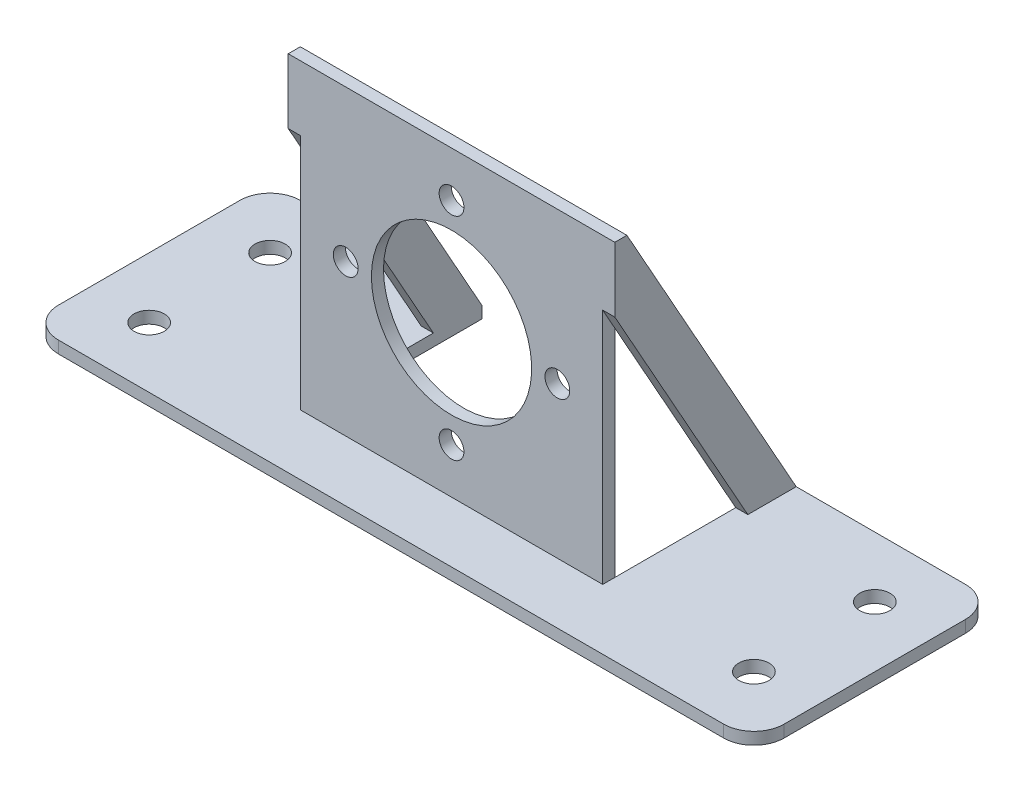
ISO-10303-21;
HEADER;
FILE_DESCRIPTION(('STEP AP214'),'2;1');
FILE_NAME('part.step','',(''),(''),'','','');
FILE_SCHEMA(('AUTOMOTIVE_DESIGN { 1 0 10303 214 1 1 1 1 }'));
ENDSEC;
DATA;
#1=APPLICATION_CONTEXT('core data for automotive mechanical design processes');
#2=APPLICATION_PROTOCOL_DEFINITION('international standard','automotive_design',2000,#1);
#3=PRODUCT_CONTEXT('',#1,'mechanical');
#4=PRODUCT('Part','Part','',(#3));
#5=PRODUCT_RELATED_PRODUCT_CATEGORY('part','',(#4));
#6=PRODUCT_DEFINITION_FORMATION('','',#4);
#7=PRODUCT_DEFINITION_CONTEXT('part definition',#1,'design');
#8=PRODUCT_DEFINITION('design','',#6,#7);
#9=PRODUCT_DEFINITION_SHAPE('','',#8);
#10=(LENGTH_UNIT() NAMED_UNIT(*) SI_UNIT(.MILLI.,.METRE.));
#11=(NAMED_UNIT(*) PLANE_ANGLE_UNIT() SI_UNIT($,.RADIAN.));
#12=(NAMED_UNIT(*) SI_UNIT($,.STERADIAN.) SOLID_ANGLE_UNIT());
#13=UNCERTAINTY_MEASURE_WITH_UNIT(LENGTH_MEASURE(1.E-05),#10,'distance_accuracy_value','');
#14=(GEOMETRIC_REPRESENTATION_CONTEXT(3) GLOBAL_UNCERTAINTY_ASSIGNED_CONTEXT((#13)) GLOBAL_UNIT_ASSIGNED_CONTEXT((#10,
#11,#12)) REPRESENTATION_CONTEXT('',''));
#15=CARTESIAN_POINT('',(0.,0.,0.));
#16=DIRECTION('',(0.,0.,1.));
#17=DIRECTION('',(1.,0.,0.));
#18=AXIS2_PLACEMENT_3D('',#15,#16,#17);
#19=CARTESIAN_POINT('',(0.,2.,0.));
#20=DIRECTION('',(0.,-1.,0.));
#21=DIRECTION('',(0.,0.,-1.));
#22=AXIS2_PLACEMENT_3D('',#19,#20,#21);
#23=PLANE('',#22);
#24=CARTESIAN_POINT('',(10.,2.,-30.));
#25=DIRECTION('',(0.,1.,0.));
#26=DIRECTION('',(0.,0.,1.));
#27=AXIS2_PLACEMENT_3D('',#24,#25,#26);
#28=CIRCLE('',#27,2.5);
#29=CARTESIAN_POINT('',(10.,2.,-27.5));
#30=VERTEX_POINT('',#29);
#31=EDGE_CURVE('E389',#30,#30,#28,.T.);
#32=ORIENTED_EDGE('',*,*,#31,.F.);
#33=EDGE_LOOP('',(#32));
#34=FACE_BOUND('',#33,.T.);
#35=CARTESIAN_POINT('',(10.,2.,-10.));
#36=DIRECTION('',(0.,1.,0.));
#37=DIRECTION('',(0.,0.,1.));
#38=AXIS2_PLACEMENT_3D('',#35,#36,#37);
#39=CIRCLE('',#38,2.5);
#40=CARTESIAN_POINT('',(10.,2.,-7.5));
#41=VERTEX_POINT('',#40);
#42=EDGE_CURVE('E381',#41,#41,#39,.T.);
#43=ORIENTED_EDGE('',*,*,#42,.F.);
#44=EDGE_LOOP('',(#43));
#45=FACE_BOUND('',#44,.T.);
#46=CARTESIAN_POINT('',(110.,2.,-10.));
#47=DIRECTION('',(0.,1.,0.));
#48=DIRECTION('',(0.,0.,-1.));
#49=AXIS2_PLACEMENT_3D('',#46,#47,#48);
#50=CIRCLE('',#49,2.49999999999998);
#51=CARTESIAN_POINT('',(110.,2.,-12.5));
#52=VERTEX_POINT('',#51);
#53=EDGE_CURVE('E373',#52,#52,#50,.T.);
#54=ORIENTED_EDGE('',*,*,#53,.F.);
#55=EDGE_LOOP('',(#54));
#56=FACE_BOUND('',#55,.T.);
#57=CARTESIAN_POINT('',(110.,2.,-30.));
#58=DIRECTION('',(0.,1.,0.));
#59=DIRECTION('',(0.,0.,-1.));
#60=AXIS2_PLACEMENT_3D('',#57,#58,#59);
#61=CIRCLE('',#60,2.49999999999998);
#62=CARTESIAN_POINT('',(110.,2.,-32.5));
#63=VERTEX_POINT('',#62);
#64=EDGE_CURVE('E365',#63,#63,#61,.T.);
#65=ORIENTED_EDGE('',*,*,#64,.F.);
#66=EDGE_LOOP('',(#65));
#67=FACE_BOUND('',#66,.T.);
#68=DIRECTION('',(0.,0.,1.));
#69=VECTOR('',#68,1.);
#70=CARTESIAN_POINT('',(0.,2.,0.));
#71=LINE('',#70,#69);
#72=CARTESIAN_POINT('',(0.,2.,-35.));
#73=VERTEX_POINT('',#72);
#74=CARTESIAN_POINT('',(0.,2.,-5.));
#75=VERTEX_POINT('',#74);
#76=EDGE_CURVE('E397',#73,#75,#71,.T.);
#77=ORIENTED_EDGE('',*,*,#76,.T.);
#78=CARTESIAN_POINT('',(5.,2.,-5.));
#79=DIRECTION('',(0.,-1.,0.));
#80=DIRECTION('',(0.,0.,-1.));
#81=AXIS2_PLACEMENT_3D('',#78,#79,#80);
#82=CIRCLE('',#81,5.);
#83=CARTESIAN_POINT('',(5.,2.,0.));
#84=VERTEX_POINT('',#83);
#85=EDGE_CURVE('E492',#75,#84,#82,.F.);
#86=ORIENTED_EDGE('',*,*,#85,.T.);
#87=DIRECTION('',(1.,0.,0.));
#88=VECTOR('',#87,1.);
#89=CARTESIAN_POINT('',(0.,2.,0.));
#90=LINE('',#89,#88);
#91=CARTESIAN_POINT('',(115.,2.,0.));
#92=VERTEX_POINT('',#91);
#93=EDGE_CURVE('E401',#84,#92,#90,.T.);
#94=ORIENTED_EDGE('',*,*,#93,.T.);
#95=CARTESIAN_POINT('',(115.,2.,-5.));
#96=DIRECTION('',(0.,-1.,0.));
#97=DIRECTION('',(0.,0.,-1.));
#98=AXIS2_PLACEMENT_3D('',#95,#96,#97);
#99=CIRCLE('',#98,5.);
#100=CARTESIAN_POINT('',(120.,2.,-5.));
#101=VERTEX_POINT('',#100);
#102=EDGE_CURVE('E486',#92,#101,#99,.F.);
#103=ORIENTED_EDGE('',*,*,#102,.T.);
#104=DIRECTION('',(0.,0.,-1.));
#105=VECTOR('',#104,1.);
#106=CARTESIAN_POINT('',(120.,2.,0.));
#107=LINE('',#106,#105);
#108=CARTESIAN_POINT('',(120.,2.,-35.));
#109=VERTEX_POINT('',#108);
#110=EDGE_CURVE('E406',#101,#109,#107,.T.);
#111=ORIENTED_EDGE('',*,*,#110,.T.);
#112=CARTESIAN_POINT('',(115.,2.,-35.));
#113=DIRECTION('',(0.,-1.,0.));
#114=DIRECTION('',(0.,0.,-1.));
#115=AXIS2_PLACEMENT_3D('',#112,#113,#114);
#116=CIRCLE('',#115,5.);
#117=CARTESIAN_POINT('',(115.,2.,-40.));
#118=VERTEX_POINT('',#117);
#119=EDGE_CURVE('E55',#109,#118,#116,.F.);
#120=ORIENTED_EDGE('',*,*,#119,.T.);
#121=DIRECTION('',(-1.,0.,0.));
#122=VECTOR('',#121,1.);
#123=CARTESIAN_POINT('',(85.,2.,-40.));
#124=LINE('',#123,#122);
#125=CARTESIAN_POINT('',(87.,2.,-40.));
#126=VERTEX_POINT('',#125);
#127=EDGE_CURVE('E409',#118,#126,#124,.T.);
#128=ORIENTED_EDGE('',*,*,#127,.T.);
#129=DIRECTION('',(0.,0.,-1.));
#130=VECTOR('',#129,1.);
#131=CARTESIAN_POINT('',(87.,2.,-32.));
#132=LINE('',#131,#130);
#133=CARTESIAN_POINT('',(87.,2.,-32.));
#134=VERTEX_POINT('',#133);
#135=EDGE_CURVE('E235',#134,#126,#132,.T.);
#136=ORIENTED_EDGE('',*,*,#135,.F.);
#137=DIRECTION('',(-1.,0.,0.));
#138=VECTOR('',#137,1.);
#139=CARTESIAN_POINT('',(87.,2.,-32.));
#140=LINE('',#139,#138);
#141=CARTESIAN_POINT('',(85.,2.,-32.));
#142=VERTEX_POINT('',#141);
#143=EDGE_CURVE('E251',#134,#142,#140,.T.);
#144=ORIENTED_EDGE('',*,*,#143,.T.);
#145=DIRECTION('',(0.,0.,1.));
#146=VECTOR('',#145,1.);
#147=CARTESIAN_POINT('',(85.,2.,-10.));
#148=LINE('',#147,#146);
#149=CARTESIAN_POINT('',(85.,2.,-12.));
#150=VERTEX_POINT('',#149);
#151=EDGE_CURVE('E412',#142,#150,#148,.T.);
#152=ORIENTED_EDGE('',*,*,#151,.T.);
#153=DIRECTION('',(0.,0.,-1.));
#154=VECTOR('',#153,1.);
#155=CARTESIAN_POINT('',(85.,2.,0.));
#156=LINE('',#155,#154);
#157=CARTESIAN_POINT('',(85.,2.,-10.));
#158=VERTEX_POINT('',#157);
#159=EDGE_CURVE('E355',#158,#150,#156,.T.);
#160=ORIENTED_EDGE('',*,*,#159,.F.);
#161=DIRECTION('',(-1.,0.,0.));
#162=VECTOR('',#161,1.);
#163=CARTESIAN_POINT('',(35.,2.,-10.));
#164=LINE('',#163,#162);
#165=CARTESIAN_POINT('',(35.,2.,-10.));
#166=VERTEX_POINT('',#165);
#167=EDGE_CURVE('E415',#158,#166,#164,.T.);
#168=ORIENTED_EDGE('',*,*,#167,.T.);
#169=DIRECTION('',(0.,0.,-1.));
#170=VECTOR('',#169,1.);
#171=CARTESIAN_POINT('',(35.,2.,-40.));
#172=LINE('',#171,#170);
#173=CARTESIAN_POINT('',(35.,2.,-12.));
#174=VERTEX_POINT('',#173);
#175=EDGE_CURVE('E419',#166,#174,#172,.T.);
#176=ORIENTED_EDGE('',*,*,#175,.T.);
#177=CARTESIAN_POINT('',(35.,2.,-32.));
#178=VERTEX_POINT('',#177);
#179=EDGE_CURVE('E418',#174,#178,#172,.T.);
#180=ORIENTED_EDGE('',*,*,#179,.T.);
#181=DIRECTION('',(1.,0.,0.));
#182=VECTOR('',#181,1.);
#183=CARTESIAN_POINT('',(33.,2.,-32.));
#184=LINE('',#183,#182);
#185=CARTESIAN_POINT('',(33.,2.,-32.));
#186=VERTEX_POINT('',#185);
#187=EDGE_CURVE('E285',#186,#178,#184,.T.);
#188=ORIENTED_EDGE('',*,*,#187,.F.);
#189=DIRECTION('',(0.,0.,1.));
#190=VECTOR('',#189,1.);
#191=CARTESIAN_POINT('',(33.,2.,-40.));
#192=LINE('',#191,#190);
#193=CARTESIAN_POINT('',(33.,2.,-40.));
#194=VERTEX_POINT('',#193);
#195=EDGE_CURVE('E264',#194,#186,#192,.T.);
#196=ORIENTED_EDGE('',*,*,#195,.F.);
#197=DIRECTION('',(-1.,0.,0.));
#198=VECTOR('',#197,1.);
#199=CARTESIAN_POINT('',(0.,2.,-40.));
#200=LINE('',#199,#198);
#201=CARTESIAN_POINT('',(5.,2.,-40.));
#202=VERTEX_POINT('',#201);
#203=EDGE_CURVE('E423',#194,#202,#200,.T.);
#204=ORIENTED_EDGE('',*,*,#203,.T.);
#205=CARTESIAN_POINT('',(5.,2.,-35.));
#206=DIRECTION('',(0.,-1.,0.));
#207=DIRECTION('',(0.,0.,-1.));
#208=AXIS2_PLACEMENT_3D('',#205,#206,#207);
#209=CIRCLE('',#208,5.);
#210=EDGE_CURVE('E489',#202,#73,#209,.F.);
#211=ORIENTED_EDGE('',*,*,#210,.T.);
#212=EDGE_LOOP('',(#77,#86,#94,#103,#111,#120,#128,#136,#144,#152,#160,#168,#176,#180,#188,#196,
#204,#211));
#213=FACE_BOUND('',#212,.T.);
#214=ADVANCED_FACE('F39',(#34,#45,#56,#67,#213),#23,.F.);
#215=CARTESIAN_POINT('',(85.,0.,-12.));
#216=DIRECTION('',(-1.,0.,0.));
#217=DIRECTION('',(0.,0.,1.));
#218=AXIS2_PLACEMENT_3D('',#215,#216,#217);
#219=PLANE('',#218);
#220=DIRECTION('',(0.,-0.87250601594972,-0.488603368931843));
#221=VECTOR('',#220,1.);
#222=CARTESIAN_POINT('',(85.,2.,-32.));
#223=LINE('',#222,#221);
#224=CARTESIAN_POINT('',(85.,41.2857142857143,-10.));
#225=VERTEX_POINT('',#224);
#226=CARTESIAN_POINT('',(85.,37.7142857142857,-12.));
#227=VERTEX_POINT('',#226);
#228=EDGE_CURVE('E230',#225,#227,#223,.T.);
#229=ORIENTED_EDGE('',*,*,#228,.F.);
#230=DIRECTION('',(0.,-1.,0.));
#231=VECTOR('',#230,1.);
#232=CARTESIAN_POINT('',(85.,0.,-10.));
#233=LINE('',#232,#231);
#234=EDGE_CURVE('E334',#225,#158,#233,.T.);
#235=ORIENTED_EDGE('',*,*,#234,.T.);
#236=ORIENTED_EDGE('',*,*,#159,.T.);
#237=DIRECTION('',(0.,-1.,0.));
#238=VECTOR('',#237,1.);
#239=CARTESIAN_POINT('',(85.,0.,-12.));
#240=LINE('',#239,#238);
#241=EDGE_CURVE('E343',#227,#150,#240,.T.);
#242=ORIENTED_EDGE('',*,*,#241,.F.);
#243=EDGE_LOOP('',(#229,#235,#236,#242));
#244=FACE_BOUND('',#243,.T.);
#245=ADVANCED_FACE('F552',(#244),#219,.F.);
#246=CARTESIAN_POINT('',(35.,0.,-12.));
#247=DIRECTION('',(1.,0.,0.));
#248=DIRECTION('',(0.,0.,-1.));
#249=AXIS2_PLACEMENT_3D('',#246,#247,#248);
#250=PLANE('',#249);
#251=DIRECTION('',(0.,0.87250601594972,0.488603368931843));
#252=VECTOR('',#251,1.);
#253=CARTESIAN_POINT('',(35.,2.,-32.));
#254=LINE('',#253,#252);
#255=CARTESIAN_POINT('',(35.,37.7142857142857,-12.));
#256=VERTEX_POINT('',#255);
#257=CARTESIAN_POINT('',(35.,41.2857142857143,-10.));
#258=VERTEX_POINT('',#257);
#259=EDGE_CURVE('E278',#256,#258,#254,.T.);
#260=ORIENTED_EDGE('',*,*,#259,.F.);
#261=DIRECTION('',(0.,1.,0.));
#262=VECTOR('',#261,1.);
#263=CARTESIAN_POINT('',(35.,0.,-12.));
#264=LINE('',#263,#262);
#265=EDGE_CURVE('E347',#174,#256,#264,.T.);
#266=ORIENTED_EDGE('',*,*,#265,.F.);
#267=ORIENTED_EDGE('',*,*,#175,.F.);
#268=DIRECTION('',(0.,1.,0.));
#269=VECTOR('',#268,1.);
#270=CARTESIAN_POINT('',(35.,0.,-10.));
#271=LINE('',#270,#269);
#272=EDGE_CURVE('E205',#166,#258,#271,.T.);
#273=ORIENTED_EDGE('',*,*,#272,.T.);
#274=EDGE_LOOP('',(#260,#266,#267,#273));
#275=FACE_BOUND('',#274,.T.);
#276=ADVANCED_FACE('F551',(#275),#250,.F.);
#277=CARTESIAN_POINT('',(85.,2.,-10.));
#278=DIRECTION('',(1.,0.,0.));
#279=DIRECTION('',(0.,0.,-1.));
#280=AXIS2_PLACEMENT_3D('',#277,#278,#279);
#281=PLANE('',#280);
#282=CARTESIAN_POINT('',(85.,0.,-12.));
#283=VERTEX_POINT('',#282);
#284=EDGE_CURVE('E204',#150,#283,#240,.T.);
#285=ORIENTED_EDGE('',*,*,#284,.F.);
#286=ORIENTED_EDGE('',*,*,#151,.F.);
#287=EDGE_CURVE('E243',#227,#142,#223,.T.);
#288=ORIENTED_EDGE('',*,*,#287,.F.);
#289=CARTESIAN_POINT('',(85.,52.,-12.));
#290=VERTEX_POINT('',#289);
#291=EDGE_CURVE('E338',#290,#227,#240,.T.);
#292=ORIENTED_EDGE('',*,*,#291,.F.);
#293=DIRECTION('',(0.,0.87250601594972,0.488603368931843));
#294=VECTOR('',#293,1.);
#295=CARTESIAN_POINT('',(85.,2.,-40.));
#296=LINE('',#295,#294);
#297=CARTESIAN_POINT('',(85.,2.,-40.));
#298=VERTEX_POINT('',#297);
#299=EDGE_CURVE('E226',#298,#290,#296,.T.);
#300=ORIENTED_EDGE('',*,*,#299,.F.);
#301=DIRECTION('',(0.,-1.,0.));
#302=VECTOR('',#301,1.);
#303=CARTESIAN_POINT('',(85.,2.,-40.));
#304=LINE('',#303,#302);
#305=CARTESIAN_POINT('',(85.,0.,-40.));
#306=VERTEX_POINT('',#305);
#307=EDGE_CURVE('E454',#298,#306,#304,.T.);
#308=ORIENTED_EDGE('',*,*,#307,.T.);
#309=DIRECTION('',(0.,0.,1.));
#310=VECTOR('',#309,1.);
#311=CARTESIAN_POINT('',(85.,0.,-10.));
#312=LINE('',#311,#310);
#313=EDGE_CURVE('E442',#306,#283,#312,.T.);
#314=ORIENTED_EDGE('',*,*,#313,.T.);
#315=EDGE_LOOP('',(#285,#286,#288,#292,#300,#308,#314));
#316=FACE_BOUND('',#315,.T.);
#317=ADVANCED_FACE('F527',(#316),#281,.F.);
#318=CARTESIAN_POINT('',(35.,2.,-40.));
#319=DIRECTION('',(-1.,0.,0.));
#320=DIRECTION('',(0.,0.,1.));
#321=AXIS2_PLACEMENT_3D('',#318,#319,#320);
#322=PLANE('',#321);
#323=CARTESIAN_POINT('',(35.,0.,-12.));
#324=VERTEX_POINT('',#323);
#325=EDGE_CURVE('E348',#324,#174,#264,.T.);
#326=ORIENTED_EDGE('',*,*,#325,.F.);
#327=DIRECTION('',(0.,0.,-1.));
#328=VECTOR('',#327,1.);
#329=CARTESIAN_POINT('',(35.,0.,-40.));
#330=LINE('',#329,#328);
#331=CARTESIAN_POINT('',(35.,0.,-40.));
#332=VERTEX_POINT('',#331);
#333=EDGE_CURVE('E445',#324,#332,#330,.T.);
#334=ORIENTED_EDGE('',*,*,#333,.T.);
#335=DIRECTION('',(0.,-1.,0.));
#336=VECTOR('',#335,1.);
#337=CARTESIAN_POINT('',(35.,2.,-40.));
#338=LINE('',#337,#336);
#339=CARTESIAN_POINT('',(35.,2.,-40.));
#340=VERTEX_POINT('',#339);
#341=EDGE_CURVE('E428',#340,#332,#338,.T.);
#342=ORIENTED_EDGE('',*,*,#341,.F.);
#343=DIRECTION('',(0.,-0.87250601594972,-0.488603368931843));
#344=VECTOR('',#343,1.);
#345=CARTESIAN_POINT('',(35.,52.,-12.));
#346=LINE('',#345,#344);
#347=CARTESIAN_POINT('',(35.,52.,-12.));
#348=VERTEX_POINT('',#347);
#349=EDGE_CURVE('E256',#348,#340,#346,.T.);
#350=ORIENTED_EDGE('',*,*,#349,.F.);
#351=DIRECTION('',(0.,1.,0.));
#352=VECTOR('',#351,1.);
#353=CARTESIAN_POINT('',(35.,0.,-12.));
#354=LINE('',#353,#352);
#355=EDGE_CURVE('E293',#256,#348,#354,.T.);
#356=ORIENTED_EDGE('',*,*,#355,.F.);
#357=EDGE_CURVE('E260',#178,#256,#254,.T.);
#358=ORIENTED_EDGE('',*,*,#357,.F.);
#359=ORIENTED_EDGE('',*,*,#179,.F.);
#360=EDGE_LOOP('',(#326,#334,#342,#350,#356,#358,#359));
#361=FACE_BOUND('',#360,.T.);
#362=ADVANCED_FACE('F585',(#361),#322,.F.);
#363=CARTESIAN_POINT('',(0.,0.,0.));
#364=DIRECTION('',(0.,-1.,0.));
#365=DIRECTION('',(0.,0.,-1.));
#366=AXIS2_PLACEMENT_3D('',#363,#364,#365);
#367=PLANE('',#366);
#368=CARTESIAN_POINT('',(110.,0.,-10.));
#369=DIRECTION('',(0.,1.,0.));
#370=DIRECTION('',(0.,0.,-1.));
#371=AXIS2_PLACEMENT_3D('',#368,#369,#370);
#372=CIRCLE('',#371,2.49999999999998);
#373=CARTESIAN_POINT('',(110.,0.,-12.5));
#374=VERTEX_POINT('',#373);
#375=EDGE_CURVE('E369',#374,#374,#372,.T.);
#376=ORIENTED_EDGE('',*,*,#375,.T.);
#377=EDGE_LOOP('',(#376));
#378=FACE_BOUND('',#377,.T.);
#379=CARTESIAN_POINT('',(10.,0.,-30.));
#380=DIRECTION('',(0.,1.,0.));
#381=DIRECTION('',(0.,0.,1.));
#382=AXIS2_PLACEMENT_3D('',#379,#380,#381);
#383=CIRCLE('',#382,2.5);
#384=CARTESIAN_POINT('',(10.,0.,-27.5));
#385=VERTEX_POINT('',#384);
#386=EDGE_CURVE('E385',#385,#385,#383,.T.);
#387=ORIENTED_EDGE('',*,*,#386,.T.);
#388=EDGE_LOOP('',(#387));
#389=FACE_BOUND('',#388,.T.);
#390=DIRECTION('',(1.,0.,0.));
#391=VECTOR('',#390,1.);
#392=CARTESIAN_POINT('',(0.,0.,0.));
#393=LINE('',#392,#391);
#394=CARTESIAN_POINT('',(5.,0.,0.));
#395=VERTEX_POINT('',#394);
#396=CARTESIAN_POINT('',(115.,0.,0.));
#397=VERTEX_POINT('',#396);
#398=EDGE_CURVE('E432',#395,#397,#393,.T.);
#399=ORIENTED_EDGE('',*,*,#398,.F.);
#400=CARTESIAN_POINT('',(5.,0.,-5.));
#401=DIRECTION('',(0.,-1.,0.));
#402=DIRECTION('',(0.,0.,-1.));
#403=AXIS2_PLACEMENT_3D('',#400,#401,#402);
#404=CIRCLE('',#403,5.);
#405=CARTESIAN_POINT('',(0.,0.,-5.));
#406=VERTEX_POINT('',#405);
#407=EDGE_CURVE('E474',#395,#406,#404,.T.);
#408=ORIENTED_EDGE('',*,*,#407,.T.);
#409=DIRECTION('',(0.,0.,1.));
#410=VECTOR('',#409,1.);
#411=CARTESIAN_POINT('',(0.,0.,0.));
#412=LINE('',#411,#410);
#413=CARTESIAN_POINT('',(0.,0.,-35.));
#414=VERTEX_POINT('',#413);
#415=EDGE_CURVE('E393',#414,#406,#412,.T.);
#416=ORIENTED_EDGE('',*,*,#415,.F.);
#417=CARTESIAN_POINT('',(5.,0.,-35.));
#418=DIRECTION('',(0.,-1.,0.));
#419=DIRECTION('',(0.,0.,-1.));
#420=AXIS2_PLACEMENT_3D('',#417,#418,#419);
#421=CIRCLE('',#420,5.);
#422=CARTESIAN_POINT('',(5.,0.,-40.));
#423=VERTEX_POINT('',#422);
#424=EDGE_CURVE('E471',#414,#423,#421,.T.);
#425=ORIENTED_EDGE('',*,*,#424,.T.);
#426=DIRECTION('',(-1.,0.,0.));
#427=VECTOR('',#426,1.);
#428=CARTESIAN_POINT('',(0.,0.,-40.));
#429=LINE('',#428,#427);
#430=EDGE_CURVE('E402',#332,#423,#429,.T.);
#431=ORIENTED_EDGE('',*,*,#430,.F.);
#432=ORIENTED_EDGE('',*,*,#333,.F.);
#433=DIRECTION('',(-1.,0.,0.));
#434=VECTOR('',#433,1.);
#435=CARTESIAN_POINT('',(85.,0.,-12.));
#436=LINE('',#435,#434);
#437=EDGE_CURVE('E342',#283,#324,#436,.T.);
#438=ORIENTED_EDGE('',*,*,#437,.F.);
#439=ORIENTED_EDGE('',*,*,#313,.F.);
#440=DIRECTION('',(-1.,0.,0.));
#441=VECTOR('',#440,1.);
#442=CARTESIAN_POINT('',(85.,0.,-40.));
#443=LINE('',#442,#441);
#444=CARTESIAN_POINT('',(115.,0.,-40.));
#445=VERTEX_POINT('',#444);
#446=EDGE_CURVE('E439',#445,#306,#443,.T.);
#447=ORIENTED_EDGE('',*,*,#446,.F.);
#448=CARTESIAN_POINT('',(115.,0.,-35.));
#449=DIRECTION('',(0.,-1.,0.));
#450=DIRECTION('',(0.,0.,-1.));
#451=AXIS2_PLACEMENT_3D('',#448,#449,#450);
#452=CIRCLE('',#451,5.);
#453=CARTESIAN_POINT('',(120.,0.,-35.));
#454=VERTEX_POINT('',#453);
#455=EDGE_CURVE('E465',#445,#454,#452,.T.);
#456=ORIENTED_EDGE('',*,*,#455,.T.);
#457=DIRECTION('',(0.,0.,-1.));
#458=VECTOR('',#457,1.);
#459=CARTESIAN_POINT('',(120.,0.,0.));
#460=LINE('',#459,#458);
#461=CARTESIAN_POINT('',(120.,0.,-5.));
#462=VERTEX_POINT('',#461);
#463=EDGE_CURVE('E436',#462,#454,#460,.T.);
#464=ORIENTED_EDGE('',*,*,#463,.F.);
#465=CARTESIAN_POINT('',(115.,0.,-5.));
#466=DIRECTION('',(0.,-1.,0.));
#467=DIRECTION('',(0.,0.,-1.));
#468=AXIS2_PLACEMENT_3D('',#465,#466,#467);
#469=CIRCLE('',#468,5.);
#470=EDGE_CURVE('E468',#462,#397,#469,.T.);
#471=ORIENTED_EDGE('',*,*,#470,.T.);
#472=EDGE_LOOP('',(#399,#408,#416,#425,#431,#432,#438,#439,#447,#456,#464,#471));
#473=FACE_BOUND('',#472,.T.);
#474=CARTESIAN_POINT('',(10.,0.,-10.));
#475=DIRECTION('',(0.,1.,0.));
#476=DIRECTION('',(0.,0.,1.));
#477=AXIS2_PLACEMENT_3D('',#474,#475,#476);
#478=CIRCLE('',#477,2.5);
#479=CARTESIAN_POINT('',(10.,0.,-7.5));
#480=VERTEX_POINT('',#479);
#481=EDGE_CURVE('E377',#480,#480,#478,.T.);
#482=ORIENTED_EDGE('',*,*,#481,.T.);
#483=EDGE_LOOP('',(#482));
#484=FACE_BOUND('',#483,.T.);
#485=CARTESIAN_POINT('',(110.,0.,-30.));
#486=DIRECTION('',(0.,1.,0.));
#487=DIRECTION('',(0.,0.,-1.));
#488=AXIS2_PLACEMENT_3D('',#485,#486,#487);
#489=CIRCLE('',#488,2.49999999999998);
#490=CARTESIAN_POINT('',(110.,0.,-32.5));
#491=VERTEX_POINT('',#490);
#492=EDGE_CURVE('E364',#491,#491,#489,.T.);
#493=ORIENTED_EDGE('',*,*,#492,.T.);
#494=EDGE_LOOP('',(#493));
#495=FACE_BOUND('',#494,.T.);
#496=ADVANCED_FACE('F508',(#378,#389,#473,#484,#495),#367,.T.);
#497=CARTESIAN_POINT('',(0.,2.,0.));
#498=DIRECTION('',(1.,0.,0.));
#499=DIRECTION('',(0.,0.,-1.));
#500=AXIS2_PLACEMENT_3D('',#497,#498,#499);
#501=PLANE('',#500);
#502=ORIENTED_EDGE('',*,*,#415,.T.);
#503=DIRECTION('',(0.,-1.,0.));
#504=VECTOR('',#503,1.);
#505=CARTESIAN_POINT('',(0.,2.,-5.));
#506=LINE('',#505,#504);
#507=EDGE_CURVE('E481',#406,#75,#506,.F.);
#508=ORIENTED_EDGE('',*,*,#507,.T.);
#509=ORIENTED_EDGE('',*,*,#76,.F.);
#510=DIRECTION('',(0.,-1.,0.));
#511=VECTOR('',#510,1.);
#512=CARTESIAN_POINT('',(0.,2.,-35.));
#513=LINE('',#512,#511);
#514=EDGE_CURVE('E477',#73,#414,#513,.T.);
#515=ORIENTED_EDGE('',*,*,#514,.T.);
#516=EDGE_LOOP('',(#502,#508,#509,#515));
#517=FACE_BOUND('',#516,.T.);
#518=ADVANCED_FACE('F584',(#517),#501,.F.);
#519=CARTESIAN_POINT('',(0.,2.,0.));
#520=DIRECTION('',(0.,0.,-1.));
#521=DIRECTION('',(-1.,0.,0.));
#522=AXIS2_PLACEMENT_3D('',#519,#520,#521);
#523=PLANE('',#522);
#524=ORIENTED_EDGE('',*,*,#93,.F.);
#525=DIRECTION('',(0.,-1.,0.));
#526=VECTOR('',#525,1.);
#527=CARTESIAN_POINT('',(5.,2.,0.));
#528=LINE('',#527,#526);
#529=EDGE_CURVE('E461',#84,#395,#528,.T.);
#530=ORIENTED_EDGE('',*,*,#529,.T.);
#531=ORIENTED_EDGE('',*,*,#398,.T.);
#532=DIRECTION('',(0.,-1.,0.));
#533=VECTOR('',#532,1.);
#534=CARTESIAN_POINT('',(115.,2.,0.));
#535=LINE('',#534,#533);
#536=EDGE_CURVE('E458',#397,#92,#535,.F.);
#537=ORIENTED_EDGE('',*,*,#536,.T.);
#538=EDGE_LOOP('',(#524,#530,#531,#537));
#539=FACE_BOUND('',#538,.T.);
#540=ADVANCED_FACE('F599',(#539),#523,.F.);
#541=CARTESIAN_POINT('',(120.,2.,0.));
#542=DIRECTION('',(-1.,0.,0.));
#543=DIRECTION('',(0.,0.,1.));
#544=AXIS2_PLACEMENT_3D('',#541,#542,#543);
#545=PLANE('',#544);
#546=ORIENTED_EDGE('',*,*,#110,.F.);
#547=DIRECTION('',(0.,-1.,0.));
#548=VECTOR('',#547,1.);
#549=CARTESIAN_POINT('',(120.,2.,-5.));
#550=LINE('',#549,#548);
#551=EDGE_CURVE('E48',#101,#462,#550,.T.);
#552=ORIENTED_EDGE('',*,*,#551,.T.);
#553=ORIENTED_EDGE('',*,*,#463,.T.);
#554=DIRECTION('',(0.,-1.,0.));
#555=VECTOR('',#554,1.);
#556=CARTESIAN_POINT('',(120.,2.,-35.));
#557=LINE('',#556,#555);
#558=EDGE_CURVE('E63',#454,#109,#557,.F.);
#559=ORIENTED_EDGE('',*,*,#558,.T.);
#560=EDGE_LOOP('',(#546,#552,#553,#559));
#561=FACE_BOUND('',#560,.T.);
#562=ADVANCED_FACE('F503',(#561),#545,.F.);
#563=CARTESIAN_POINT('',(85.,2.,-40.));
#564=DIRECTION('',(0.,0.,1.));
#565=DIRECTION('',(1.,0.,0.));
#566=AXIS2_PLACEMENT_3D('',#563,#564,#565);
#567=PLANE('',#566);
#568=ORIENTED_EDGE('',*,*,#127,.F.);
#569=DIRECTION('',(0.,-1.,0.));
#570=VECTOR('',#569,1.);
#571=CARTESIAN_POINT('',(115.,2.,-40.));
#572=LINE('',#571,#570);
#573=EDGE_CURVE('E11',#118,#445,#572,.T.);
#574=ORIENTED_EDGE('',*,*,#573,.T.);
#575=ORIENTED_EDGE('',*,*,#446,.T.);
#576=ORIENTED_EDGE('',*,*,#307,.F.);
#577=DIRECTION('',(-1.,0.,0.));
#578=VECTOR('',#577,1.);
#579=CARTESIAN_POINT('',(87.,2.,-40.));
#580=LINE('',#579,#578);
#581=EDGE_CURVE('E247',#126,#298,#580,.T.);
#582=ORIENTED_EDGE('',*,*,#581,.F.);
#583=EDGE_LOOP('',(#568,#574,#575,#576,#582));
#584=FACE_BOUND('',#583,.T.);
#585=ADVANCED_FACE('F515',(#584),#567,.F.);
#586=CARTESIAN_POINT('',(0.,2.,-40.));
#587=DIRECTION('',(0.,0.,1.));
#588=DIRECTION('',(1.,0.,0.));
#589=AXIS2_PLACEMENT_3D('',#586,#587,#588);
#590=PLANE('',#589);
#591=ORIENTED_EDGE('',*,*,#430,.T.);
#592=DIRECTION('',(0.,-1.,0.));
#593=VECTOR('',#592,1.);
#594=CARTESIAN_POINT('',(5.,2.,-40.));
#595=LINE('',#594,#593);
#596=EDGE_CURVE('E495',#423,#202,#595,.F.);
#597=ORIENTED_EDGE('',*,*,#596,.T.);
#598=ORIENTED_EDGE('',*,*,#203,.F.);
#599=EDGE_CURVE('E424',#340,#194,#200,.T.);
#600=ORIENTED_EDGE('',*,*,#599,.F.);
#601=ORIENTED_EDGE('',*,*,#341,.T.);
#602=EDGE_LOOP('',(#591,#597,#598,#600,#601));
#603=FACE_BOUND('',#602,.T.);
#604=ADVANCED_FACE('F579',(#603),#590,.F.);
#605=CARTESIAN_POINT('',(10.,2.,-30.));
#606=DIRECTION('',(0.,-1.,0.));
#607=DIRECTION('',(0.,0.,-1.));
#608=AXIS2_PLACEMENT_3D('',#605,#606,#607);
#609=CYLINDRICAL_SURFACE('',#608,2.5);
#610=ORIENTED_EDGE('',*,*,#31,.T.);
#611=EDGE_LOOP('',(#610));
#612=FACE_BOUND('',#611,.T.);
#613=ORIENTED_EDGE('',*,*,#386,.F.);
#614=EDGE_LOOP('',(#613));
#615=FACE_BOUND('',#614,.T.);
#616=ADVANCED_FACE('F576',(#612,#615),#609,.F.);
#617=CARTESIAN_POINT('',(10.,2.,-10.));
#618=DIRECTION('',(0.,-1.,0.));
#619=DIRECTION('',(0.,0.,-1.));
#620=AXIS2_PLACEMENT_3D('',#617,#618,#619);
#621=CYLINDRICAL_SURFACE('',#620,2.5);
#622=ORIENTED_EDGE('',*,*,#42,.T.);
#623=EDGE_LOOP('',(#622));
#624=FACE_BOUND('',#623,.T.);
#625=ORIENTED_EDGE('',*,*,#481,.F.);
#626=EDGE_LOOP('',(#625));
#627=FACE_BOUND('',#626,.T.);
#628=ADVANCED_FACE('F572',(#624,#627),#621,.F.);
#629=CARTESIAN_POINT('',(110.,2.,-10.));
#630=DIRECTION('',(0.,-1.,0.));
#631=DIRECTION('',(0.,0.,-1.));
#632=AXIS2_PLACEMENT_3D('',#629,#630,#631);
#633=CYLINDRICAL_SURFACE('',#632,2.49999999999998);
#634=ORIENTED_EDGE('',*,*,#53,.T.);
#635=EDGE_LOOP('',(#634));
#636=FACE_BOUND('',#635,.T.);
#637=ORIENTED_EDGE('',*,*,#375,.F.);
#638=EDGE_LOOP('',(#637));
#639=FACE_BOUND('',#638,.T.);
#640=ADVANCED_FACE('F568',(#636,#639),#633,.F.);
#641=CARTESIAN_POINT('',(110.,2.,-30.));
#642=DIRECTION('',(0.,-1.,0.));
#643=DIRECTION('',(0.,0.,-1.));
#644=AXIS2_PLACEMENT_3D('',#641,#642,#643);
#645=CYLINDRICAL_SURFACE('',#644,2.49999999999998);
#646=ORIENTED_EDGE('',*,*,#64,.T.);
#647=EDGE_LOOP('',(#646));
#648=FACE_BOUND('',#647,.T.);
#649=ORIENTED_EDGE('',*,*,#492,.F.);
#650=EDGE_LOOP('',(#649));
#651=FACE_BOUND('',#650,.T.);
#652=ADVANCED_FACE('F565',(#648,#651),#645,.F.);
#653=CARTESIAN_POINT('',(0.,0.,-10.));
#654=DIRECTION('',(0.,0.,1.));
#655=DIRECTION('',(1.,0.,0.));
#656=AXIS2_PLACEMENT_3D('',#653,#654,#655);
#657=PLANE('',#656);
#658=CARTESIAN_POINT('',(77.5,27.,-10.));
#659=DIRECTION('',(0.,0.,-1.));
#660=DIRECTION('',(-1.,0.,0.));
#661=AXIS2_PLACEMENT_3D('',#658,#659,#660);
#662=CIRCLE('',#661,2.04999999999999);
#663=CARTESIAN_POINT('',(75.45,27.,-10.));
#664=VERTEX_POINT('',#663);
#665=EDGE_CURVE('E297',#664,#664,#662,.T.);
#666=ORIENTED_EDGE('',*,*,#665,.T.);
#667=EDGE_LOOP('',(#666));
#668=FACE_BOUND('',#667,.T.);
#669=CARTESIAN_POINT('',(42.5,27.,-10.));
#670=DIRECTION('',(0.,0.,-1.));
#671=DIRECTION('',(-1.,0.,0.));
#672=AXIS2_PLACEMENT_3D('',#669,#670,#671);
#673=CIRCLE('',#672,2.05);
#674=CARTESIAN_POINT('',(40.45,27.,-10.));
#675=VERTEX_POINT('',#674);
#676=EDGE_CURVE('E310',#675,#675,#673,.T.);
#677=ORIENTED_EDGE('',*,*,#676,.T.);
#678=EDGE_LOOP('',(#677));
#679=FACE_BOUND('',#678,.T.);
#680=CARTESIAN_POINT('',(60.,27.,-10.));
#681=DIRECTION('',(0.,0.,-1.));
#682=DIRECTION('',(-1.,0.,0.));
#683=AXIS2_PLACEMENT_3D('',#680,#681,#682);
#684=CIRCLE('',#683,13.25);
#685=CARTESIAN_POINT('',(46.75,27.,-10.));
#686=VERTEX_POINT('',#685);
#687=EDGE_CURVE('E326',#686,#686,#684,.T.);
#688=ORIENTED_EDGE('',*,*,#687,.T.);
#689=EDGE_LOOP('',(#688));
#690=FACE_BOUND('',#689,.T.);
#691=CARTESIAN_POINT('',(60.,44.5,-10.));
#692=DIRECTION('',(0.,0.,-1.));
#693=DIRECTION('',(-1.,0.,0.));
#694=AXIS2_PLACEMENT_3D('',#691,#692,#693);
#695=CIRCLE('',#694,2.05);
#696=CARTESIAN_POINT('',(57.95,44.5,-10.));
#697=VERTEX_POINT('',#696);
#698=EDGE_CURVE('E318',#697,#697,#695,.T.);
#699=ORIENTED_EDGE('',*,*,#698,.T.);
#700=EDGE_LOOP('',(#699));
#701=FACE_BOUND('',#700,.T.);
#702=CARTESIAN_POINT('',(60.,9.5,-10.));
#703=DIRECTION('',(0.,0.,-1.));
#704=DIRECTION('',(-1.,0.,0.));
#705=AXIS2_PLACEMENT_3D('',#702,#703,#704);
#706=CIRCLE('',#705,2.05);
#707=CARTESIAN_POINT('',(57.95,9.5,-10.));
#708=VERTEX_POINT('',#707);
#709=EDGE_CURVE('E302',#708,#708,#706,.T.);
#710=ORIENTED_EDGE('',*,*,#709,.T.);
#711=EDGE_LOOP('',(#710));
#712=FACE_BOUND('',#711,.T.);
#713=ORIENTED_EDGE('',*,*,#167,.F.);
#714=ORIENTED_EDGE('',*,*,#234,.F.);
#715=DIRECTION('',(-1.,0.,0.));
#716=VECTOR('',#715,1.);
#717=CARTESIAN_POINT('',(87.,41.2857142857143,-10.));
#718=LINE('',#717,#716);
#719=CARTESIAN_POINT('',(87.,41.2857142857143,-10.));
#720=VERTEX_POINT('',#719);
#721=EDGE_CURVE('E213',#720,#225,#718,.T.);
#722=ORIENTED_EDGE('',*,*,#721,.F.);
#723=DIRECTION('',(0.,-1.,0.));
#724=VECTOR('',#723,1.);
#725=CARTESIAN_POINT('',(87.,52.,-10.));
#726=LINE('',#725,#724);
#727=CARTESIAN_POINT('',(87.,52.,-10.));
#728=VERTEX_POINT('',#727);
#729=EDGE_CURVE('E208',#728,#720,#726,.T.);
#730=ORIENTED_EDGE('',*,*,#729,.F.);
#731=DIRECTION('',(1.,0.,0.));
#732=VECTOR('',#731,1.);
#733=CARTESIAN_POINT('',(85.,52.,-10.));
#734=LINE('',#733,#732);
#735=CARTESIAN_POINT('',(33.,52.,-10.));
#736=VERTEX_POINT('',#735);
#737=EDGE_CURVE('E191',#736,#728,#734,.T.);
#738=ORIENTED_EDGE('',*,*,#737,.F.);
#739=DIRECTION('',(0.,1.,0.));
#740=VECTOR('',#739,1.);
#741=CARTESIAN_POINT('',(33.,41.2857142857143,-10.));
#742=LINE('',#741,#740);
#743=CARTESIAN_POINT('',(33.,41.2857142857143,-10.));
#744=VERTEX_POINT('',#743);
#745=EDGE_CURVE('E271',#744,#736,#742,.T.);
#746=ORIENTED_EDGE('',*,*,#745,.F.);
#747=DIRECTION('',(1.,0.,0.));
#748=VECTOR('',#747,1.);
#749=CARTESIAN_POINT('',(33.,41.2857142857143,-10.));
#750=LINE('',#749,#748);
#751=EDGE_CURVE('E274',#744,#258,#750,.T.);
#752=ORIENTED_EDGE('',*,*,#751,.T.);
#753=ORIENTED_EDGE('',*,*,#272,.F.);
#754=EDGE_LOOP('',(#713,#714,#722,#730,#738,#746,#752,#753));
#755=FACE_BOUND('',#754,.T.);
#756=ADVANCED_FACE('F210',(#668,#679,#690,#701,#712,#755),#657,.T.);
#757=CARTESIAN_POINT('',(0.,0.,-12.));
#758=DIRECTION('',(0.,0.,1.));
#759=DIRECTION('',(1.,0.,0.));
#760=AXIS2_PLACEMENT_3D('',#757,#758,#759);
#761=PLANE('',#760);
#762=ORIENTED_EDGE('',*,*,#291,.T.);
#763=ORIENTED_EDGE('',*,*,#241,.T.);
#764=ORIENTED_EDGE('',*,*,#284,.T.);
#765=ORIENTED_EDGE('',*,*,#437,.T.);
#766=ORIENTED_EDGE('',*,*,#325,.T.);
#767=ORIENTED_EDGE('',*,*,#265,.T.);
#768=ORIENTED_EDGE('',*,*,#355,.T.);
#769=DIRECTION('',(1.,0.,0.));
#770=VECTOR('',#769,1.);
#771=CARTESIAN_POINT('',(85.,52.,-12.));
#772=LINE('',#771,#770);
#773=EDGE_CURVE('E352',#348,#290,#772,.T.);
#774=ORIENTED_EDGE('',*,*,#773,.T.);
#775=EDGE_LOOP('',(#762,#763,#764,#765,#766,#767,#768,#774));
#776=FACE_BOUND('',#775,.T.);
#777=CARTESIAN_POINT('',(60.,27.,-12.));
#778=DIRECTION('',(0.,0.,-1.));
#779=DIRECTION('',(-1.,0.,0.));
#780=AXIS2_PLACEMENT_3D('',#777,#778,#779);
#781=CIRCLE('',#780,13.25);
#782=CARTESIAN_POINT('',(46.75,27.,-12.));
#783=VERTEX_POINT('',#782);
#784=EDGE_CURVE('E330',#783,#783,#781,.T.);
#785=ORIENTED_EDGE('',*,*,#784,.F.);
#786=EDGE_LOOP('',(#785));
#787=FACE_BOUND('',#786,.T.);
#788=CARTESIAN_POINT('',(60.,44.5,-12.));
#789=DIRECTION('',(0.,0.,-1.));
#790=DIRECTION('',(-1.,0.,0.));
#791=AXIS2_PLACEMENT_3D('',#788,#789,#790);
#792=CIRCLE('',#791,2.05);
#793=CARTESIAN_POINT('',(57.95,44.5,-12.));
#794=VERTEX_POINT('',#793);
#795=EDGE_CURVE('E322',#794,#794,#792,.T.);
#796=ORIENTED_EDGE('',*,*,#795,.F.);
#797=EDGE_LOOP('',(#796));
#798=FACE_BOUND('',#797,.T.);
#799=CARTESIAN_POINT('',(42.5,27.,-12.));
#800=DIRECTION('',(0.,0.,-1.));
#801=DIRECTION('',(-1.,0.,0.));
#802=AXIS2_PLACEMENT_3D('',#799,#800,#801);
#803=CIRCLE('',#802,2.05);
#804=CARTESIAN_POINT('',(40.45,27.,-12.));
#805=VERTEX_POINT('',#804);
#806=EDGE_CURVE('E314',#805,#805,#803,.T.);
#807=ORIENTED_EDGE('',*,*,#806,.F.);
#808=EDGE_LOOP('',(#807));
#809=FACE_BOUND('',#808,.T.);
#810=CARTESIAN_POINT('',(60.,9.5,-12.));
#811=DIRECTION('',(0.,0.,-1.));
#812=DIRECTION('',(-1.,0.,0.));
#813=AXIS2_PLACEMENT_3D('',#810,#811,#812);
#814=CIRCLE('',#813,2.05);
#815=CARTESIAN_POINT('',(57.95,9.5,-12.));
#816=VERTEX_POINT('',#815);
#817=EDGE_CURVE('E306',#816,#816,#814,.T.);
#818=ORIENTED_EDGE('',*,*,#817,.F.);
#819=EDGE_LOOP('',(#818));
#820=FACE_BOUND('',#819,.T.);
#821=CARTESIAN_POINT('',(77.5,27.,-12.));
#822=DIRECTION('',(0.,0.,-1.));
#823=DIRECTION('',(-1.,0.,0.));
#824=AXIS2_PLACEMENT_3D('',#821,#822,#823);
#825=CIRCLE('',#824,2.04999999999999);
#826=CARTESIAN_POINT('',(75.45,27.,-12.));
#827=VERTEX_POINT('',#826);
#828=EDGE_CURVE('E298',#827,#827,#825,.T.);
#829=ORIENTED_EDGE('',*,*,#828,.F.);
#830=EDGE_LOOP('',(#829));
#831=FACE_BOUND('',#830,.T.);
#832=ADVANCED_FACE('F533',(#776,#787,#798,#809,#820,#831),#761,.F.);
#833=CARTESIAN_POINT('',(85.,52.,-12.));
#834=DIRECTION('',(0.,-1.,0.));
#835=DIRECTION('',(0.,0.,-1.));
#836=AXIS2_PLACEMENT_3D('',#833,#834,#835);
#837=PLANE('',#836);
#838=ORIENTED_EDGE('',*,*,#737,.T.);
#839=DIRECTION('',(0.,0.,1.));
#840=VECTOR('',#839,1.);
#841=CARTESIAN_POINT('',(87.,52.,-12.));
#842=LINE('',#841,#840);
#843=CARTESIAN_POINT('',(87.,52.,-12.));
#844=VERTEX_POINT('',#843);
#845=EDGE_CURVE('E196',#844,#728,#842,.T.);
#846=ORIENTED_EDGE('',*,*,#845,.F.);
#847=DIRECTION('',(-1.,0.,0.));
#848=VECTOR('',#847,1.);
#849=CARTESIAN_POINT('',(87.,52.,-12.));
#850=LINE('',#849,#848);
#851=EDGE_CURVE('E240',#844,#290,#850,.T.);
#852=ORIENTED_EDGE('',*,*,#851,.T.);
#853=ORIENTED_EDGE('',*,*,#773,.F.);
#854=DIRECTION('',(1.,0.,0.));
#855=VECTOR('',#854,1.);
#856=CARTESIAN_POINT('',(33.,52.,-12.));
#857=LINE('',#856,#855);
#858=CARTESIAN_POINT('',(33.,52.,-12.));
#859=VERTEX_POINT('',#858);
#860=EDGE_CURVE('E289',#859,#348,#857,.T.);
#861=ORIENTED_EDGE('',*,*,#860,.F.);
#862=DIRECTION('',(0.,0.,-1.));
#863=VECTOR('',#862,1.);
#864=CARTESIAN_POINT('',(33.,52.,-10.));
#865=LINE('',#864,#863);
#866=EDGE_CURVE('E199',#736,#859,#865,.T.);
#867=ORIENTED_EDGE('',*,*,#866,.F.);
#868=EDGE_LOOP('',(#838,#846,#852,#853,#861,#867));
#869=FACE_BOUND('',#868,.T.);
#870=ADVANCED_FACE('F193',(#869),#837,.F.);
#871=CARTESIAN_POINT('',(60.,27.,-12.));
#872=DIRECTION('',(0.,0.,1.));
#873=DIRECTION('',(1.,0.,0.));
#874=AXIS2_PLACEMENT_3D('',#871,#872,#873);
#875=CYLINDRICAL_SURFACE('',#874,13.25);
#876=ORIENTED_EDGE('',*,*,#784,.T.);
#877=EDGE_LOOP('',(#876));
#878=FACE_BOUND('',#877,.T.);
#879=ORIENTED_EDGE('',*,*,#687,.F.);
#880=EDGE_LOOP('',(#879));
#881=FACE_BOUND('',#880,.T.);
#882=ADVANCED_FACE('F673',(#878,#881),#875,.F.);
#883=CARTESIAN_POINT('',(60.,44.5,-12.));
#884=DIRECTION('',(0.,0.,1.));
#885=DIRECTION('',(1.,0.,0.));
#886=AXIS2_PLACEMENT_3D('',#883,#884,#885);
#887=CYLINDRICAL_SURFACE('',#886,2.05);
#888=ORIENTED_EDGE('',*,*,#795,.T.);
#889=EDGE_LOOP('',(#888));
#890=FACE_BOUND('',#889,.T.);
#891=ORIENTED_EDGE('',*,*,#698,.F.);
#892=EDGE_LOOP('',(#891));
#893=FACE_BOUND('',#892,.T.);
#894=ADVANCED_FACE('F669',(#890,#893),#887,.F.);
#895=CARTESIAN_POINT('',(42.5,27.,-12.));
#896=DIRECTION('',(0.,0.,1.));
#897=DIRECTION('',(1.,0.,0.));
#898=AXIS2_PLACEMENT_3D('',#895,#896,#897);
#899=CYLINDRICAL_SURFACE('',#898,2.05);
#900=ORIENTED_EDGE('',*,*,#806,.T.);
#901=EDGE_LOOP('',(#900));
#902=FACE_BOUND('',#901,.T.);
#903=ORIENTED_EDGE('',*,*,#676,.F.);
#904=EDGE_LOOP('',(#903));
#905=FACE_BOUND('',#904,.T.);
#906=ADVANCED_FACE('F665',(#902,#905),#899,.F.);
#907=CARTESIAN_POINT('',(60.,9.5,-12.));
#908=DIRECTION('',(0.,0.,1.));
#909=DIRECTION('',(1.,0.,0.));
#910=AXIS2_PLACEMENT_3D('',#907,#908,#909);
#911=CYLINDRICAL_SURFACE('',#910,2.05);
#912=ORIENTED_EDGE('',*,*,#817,.T.);
#913=EDGE_LOOP('',(#912));
#914=FACE_BOUND('',#913,.T.);
#915=ORIENTED_EDGE('',*,*,#709,.F.);
#916=EDGE_LOOP('',(#915));
#917=FACE_BOUND('',#916,.T.);
#918=ADVANCED_FACE('F661',(#914,#917),#911,.F.);
#919=CARTESIAN_POINT('',(77.5,27.,-12.));
#920=DIRECTION('',(0.,0.,1.));
#921=DIRECTION('',(1.,0.,0.));
#922=AXIS2_PLACEMENT_3D('',#919,#920,#921);
#923=CYLINDRICAL_SURFACE('',#922,2.04999999999999);
#924=ORIENTED_EDGE('',*,*,#828,.T.);
#925=EDGE_LOOP('',(#924));
#926=FACE_BOUND('',#925,.T.);
#927=ORIENTED_EDGE('',*,*,#665,.F.);
#928=EDGE_LOOP('',(#927));
#929=FACE_BOUND('',#928,.T.);
#930=ADVANCED_FACE('F658',(#926,#929),#923,.F.);
#931=CARTESIAN_POINT('',(33.,52.,-12.));
#932=DIRECTION('',(0.,-0.488603368931843,0.87250601594972));
#933=DIRECTION('',(0.,-0.87250601594972,-0.488603368931843));
#934=AXIS2_PLACEMENT_3D('',#931,#932,#933);
#935=PLANE('',#934);
#936=ORIENTED_EDGE('',*,*,#349,.T.);
#937=ORIENTED_EDGE('',*,*,#599,.T.);
#938=DIRECTION('',(0.,-0.87250601594972,-0.488603368931843));
#939=VECTOR('',#938,1.);
#940=CARTESIAN_POINT('',(33.,52.,-12.));
#941=LINE('',#940,#939);
#942=EDGE_CURVE('E259',#859,#194,#941,.T.);
#943=ORIENTED_EDGE('',*,*,#942,.F.);
#944=ORIENTED_EDGE('',*,*,#860,.T.);
#945=EDGE_LOOP('',(#936,#937,#943,#944));
#946=FACE_BOUND('',#945,.T.);
#947=ADVANCED_FACE('F640',(#946),#935,.F.);
#948=CARTESIAN_POINT('',(33.,2.,-32.));
#949=DIRECTION('',(0.,0.488603368931843,-0.87250601594972));
#950=DIRECTION('',(0.,0.87250601594972,0.488603368931843));
#951=AXIS2_PLACEMENT_3D('',#948,#949,#950);
#952=PLANE('',#951);
#953=ORIENTED_EDGE('',*,*,#357,.T.);
#954=ORIENTED_EDGE('',*,*,#259,.T.);
#955=ORIENTED_EDGE('',*,*,#751,.F.);
#956=DIRECTION('',(0.,0.87250601594972,0.488603368931843));
#957=VECTOR('',#956,1.);
#958=CARTESIAN_POINT('',(33.,2.,-32.));
#959=LINE('',#958,#957);
#960=EDGE_CURVE('E268',#186,#744,#959,.T.);
#961=ORIENTED_EDGE('',*,*,#960,.F.);
#962=ORIENTED_EDGE('',*,*,#187,.T.);
#963=EDGE_LOOP('',(#953,#954,#955,#961,#962));
#964=FACE_BOUND('',#963,.T.);
#965=ADVANCED_FACE('F543',(#964),#952,.F.);
#966=CARTESIAN_POINT('',(33.,0.,0.));
#967=DIRECTION('',(1.,0.,0.));
#968=DIRECTION('',(0.,0.,-1.));
#969=AXIS2_PLACEMENT_3D('',#966,#967,#968);
#970=PLANE('',#969);
#971=ORIENTED_EDGE('',*,*,#866,.T.);
#972=ORIENTED_EDGE('',*,*,#942,.T.);
#973=ORIENTED_EDGE('',*,*,#195,.T.);
#974=ORIENTED_EDGE('',*,*,#960,.T.);
#975=ORIENTED_EDGE('',*,*,#745,.T.);
#976=EDGE_LOOP('',(#971,#972,#973,#974,#975));
#977=FACE_BOUND('',#976,.T.);
#978=ADVANCED_FACE('F638',(#977),#970,.F.);
#979=CARTESIAN_POINT('',(87.,2.,-32.));
#980=DIRECTION('',(0.,0.488603368931843,-0.87250601594972));
#981=DIRECTION('',(0.,0.87250601594972,0.488603368931843));
#982=AXIS2_PLACEMENT_3D('',#979,#980,#981);
#983=PLANE('',#982);
#984=ORIENTED_EDGE('',*,*,#228,.T.);
#985=ORIENTED_EDGE('',*,*,#287,.T.);
#986=ORIENTED_EDGE('',*,*,#143,.F.);
#987=DIRECTION('',(0.,-0.87250601594972,-0.488603368931843));
#988=VECTOR('',#987,1.);
#989=CARTESIAN_POINT('',(87.,2.,-32.));
#990=LINE('',#989,#988);
#991=EDGE_CURVE('E218',#720,#134,#990,.T.);
#992=ORIENTED_EDGE('',*,*,#991,.F.);
#993=ORIENTED_EDGE('',*,*,#721,.T.);
#994=EDGE_LOOP('',(#984,#985,#986,#992,#993));
#995=FACE_BOUND('',#994,.T.);
#996=ADVANCED_FACE('F521',(#995),#983,.F.);
#997=CARTESIAN_POINT('',(87.,2.,-40.));
#998=DIRECTION('',(0.,-0.488603368931843,0.87250601594972));
#999=DIRECTION('',(0.,-0.87250601594972,-0.488603368931843));
#1000=AXIS2_PLACEMENT_3D('',#997,#998,#999);
#1001=PLANE('',#1000);
#1002=ORIENTED_EDGE('',*,*,#299,.T.);
#1003=ORIENTED_EDGE('',*,*,#851,.F.);
#1004=DIRECTION('',(0.,0.87250601594972,0.488603368931843));
#1005=VECTOR('',#1004,1.);
#1006=CARTESIAN_POINT('',(87.,2.,-40.));
#1007=LINE('',#1006,#1005);
#1008=EDGE_CURVE('E223',#126,#844,#1007,.T.);
#1009=ORIENTED_EDGE('',*,*,#1008,.F.);
#1010=ORIENTED_EDGE('',*,*,#581,.T.);
#1011=EDGE_LOOP('',(#1002,#1003,#1009,#1010));
#1012=FACE_BOUND('',#1011,.T.);
#1013=ADVANCED_FACE('F642',(#1012),#1001,.F.);
#1014=CARTESIAN_POINT('',(87.,0.,0.));
#1015=DIRECTION('',(1.,0.,0.));
#1016=DIRECTION('',(0.,0.,-1.));
#1017=AXIS2_PLACEMENT_3D('',#1014,#1015,#1016);
#1018=PLANE('',#1017);
#1019=ORIENTED_EDGE('',*,*,#845,.T.);
#1020=ORIENTED_EDGE('',*,*,#729,.T.);
#1021=ORIENTED_EDGE('',*,*,#991,.T.);
#1022=ORIENTED_EDGE('',*,*,#135,.T.);
#1023=ORIENTED_EDGE('',*,*,#1008,.T.);
#1024=EDGE_LOOP('',(#1019,#1020,#1021,#1022,#1023));
#1025=FACE_BOUND('',#1024,.T.);
#1026=ADVANCED_FACE('F220',(#1025),#1018,.T.);
#1027=CARTESIAN_POINT('',(5.,2.,-5.));
#1028=DIRECTION('',(0.,-1.,0.));
#1029=DIRECTION('',(0.,0.,-1.));
#1030=AXIS2_PLACEMENT_3D('',#1027,#1028,#1029);
#1031=CYLINDRICAL_SURFACE('',#1030,5.);
#1032=ORIENTED_EDGE('',*,*,#85,.F.);
#1033=ORIENTED_EDGE('',*,*,#507,.F.);
#1034=ORIENTED_EDGE('',*,*,#407,.F.);
#1035=ORIENTED_EDGE('',*,*,#529,.F.);
#1036=EDGE_LOOP('',(#1032,#1033,#1034,#1035));
#1037=FACE_BOUND('',#1036,.T.);
#1038=ADVANCED_FACE('F606',(#1037),#1031,.T.);
#1039=CARTESIAN_POINT('',(5.,2.,-35.));
#1040=DIRECTION('',(0.,-1.,0.));
#1041=DIRECTION('',(0.,0.,-1.));
#1042=AXIS2_PLACEMENT_3D('',#1039,#1040,#1041);
#1043=CYLINDRICAL_SURFACE('',#1042,5.);
#1044=ORIENTED_EDGE('',*,*,#210,.F.);
#1045=ORIENTED_EDGE('',*,*,#596,.F.);
#1046=ORIENTED_EDGE('',*,*,#424,.F.);
#1047=ORIENTED_EDGE('',*,*,#514,.F.);
#1048=EDGE_LOOP('',(#1044,#1045,#1046,#1047));
#1049=FACE_BOUND('',#1048,.T.);
#1050=ADVANCED_FACE('F609',(#1049),#1043,.T.);
#1051=CARTESIAN_POINT('',(115.,2.,-5.));
#1052=DIRECTION('',(0.,-1.,0.));
#1053=DIRECTION('',(0.,0.,-1.));
#1054=AXIS2_PLACEMENT_3D('',#1051,#1052,#1053);
#1055=CYLINDRICAL_SURFACE('',#1054,5.);
#1056=ORIENTED_EDGE('',*,*,#102,.F.);
#1057=ORIENTED_EDGE('',*,*,#536,.F.);
#1058=ORIENTED_EDGE('',*,*,#470,.F.);
#1059=ORIENTED_EDGE('',*,*,#551,.F.);
#1060=EDGE_LOOP('',(#1056,#1057,#1058,#1059));
#1061=FACE_BOUND('',#1060,.T.);
#1062=ADVANCED_FACE('F612',(#1061),#1055,.T.);
#1063=CARTESIAN_POINT('',(115.,2.,-35.));
#1064=DIRECTION('',(0.,-1.,0.));
#1065=DIRECTION('',(0.,0.,-1.));
#1066=AXIS2_PLACEMENT_3D('',#1063,#1064,#1065);
#1067=CYLINDRICAL_SURFACE('',#1066,5.);
#1068=ORIENTED_EDGE('',*,*,#119,.F.);
#1069=ORIENTED_EDGE('',*,*,#558,.F.);
#1070=ORIENTED_EDGE('',*,*,#455,.F.);
#1071=ORIENTED_EDGE('',*,*,#573,.F.);
#1072=EDGE_LOOP('',(#1068,#1069,#1070,#1071));
#1073=FACE_BOUND('',#1072,.T.);
#1074=ADVANCED_FACE('F41',(#1073),#1067,.T.);
#1075=CLOSED_SHELL('',(#214,#245,#276,#317,#362,#496,#518,#540,#562,#585,#604,#616,#628,#640,
#652,#756,#832,#870,#882,#894,#906,#918,#930,#947,#965,#978,#996,#1013,#1026,#1038,#1050,#1062,#1074));
#1076=MANIFOLD_SOLID_BREP('B2',#1075);
#1077=ADVANCED_BREP_SHAPE_REPRESENTATION('',(#18,#1076),#14);
#1078=SHAPE_DEFINITION_REPRESENTATION(#9,#1077);
ENDSEC;
END-ISO-10303-21;
